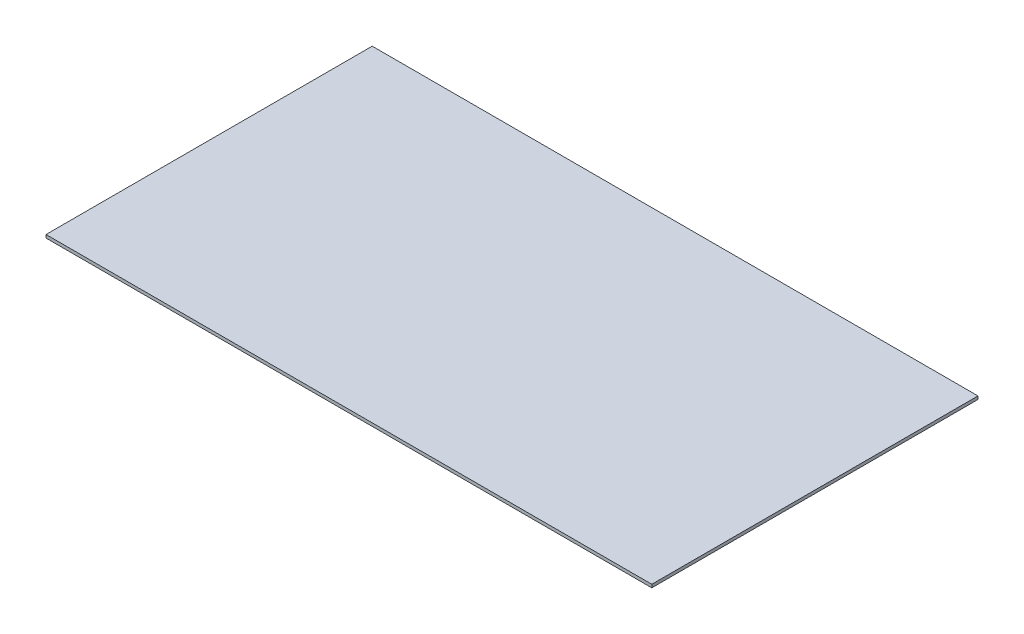
ISO-10303-21;
HEADER;
FILE_DESCRIPTION(('STEP AP214'),'2;1');
FILE_NAME('part.step','',(''),(''),'','','');
FILE_SCHEMA(('AUTOMOTIVE_DESIGN { 1 0 10303 214 1 1 1 1 }'));
ENDSEC;
DATA;
#1=APPLICATION_CONTEXT('core data for automotive mechanical design processes');
#2=APPLICATION_PROTOCOL_DEFINITION('international standard','automotive_design',2000,#1);
#3=PRODUCT_CONTEXT('',#1,'mechanical');
#4=PRODUCT('Part','Part','',(#3));
#5=PRODUCT_RELATED_PRODUCT_CATEGORY('part','',(#4));
#6=PRODUCT_DEFINITION_FORMATION('','',#4);
#7=PRODUCT_DEFINITION_CONTEXT('part definition',#1,'design');
#8=PRODUCT_DEFINITION('design','',#6,#7);
#9=PRODUCT_DEFINITION_SHAPE('','',#8);
#10=(LENGTH_UNIT() NAMED_UNIT(*) SI_UNIT(.MILLI.,.METRE.));
#11=(NAMED_UNIT(*) PLANE_ANGLE_UNIT() SI_UNIT($,.RADIAN.));
#12=(NAMED_UNIT(*) SI_UNIT($,.STERADIAN.) SOLID_ANGLE_UNIT());
#13=UNCERTAINTY_MEASURE_WITH_UNIT(LENGTH_MEASURE(1.E-05),#10,'distance_accuracy_value','');
#14=(GEOMETRIC_REPRESENTATION_CONTEXT(3) GLOBAL_UNCERTAINTY_ASSIGNED_CONTEXT((#13)) GLOBAL_UNIT_ASSIGNED_CONTEXT((#10,
#11,#12)) REPRESENTATION_CONTEXT('',''));
#15=CARTESIAN_POINT('',(0.,0.,0.));
#16=DIRECTION('',(0.,0.,1.));
#17=DIRECTION('',(1.,0.,0.));
#18=AXIS2_PLACEMENT_3D('',#15,#16,#17);
#19=CARTESIAN_POINT('',(1950.,-4.99999999999998,-525.));
#20=DIRECTION('',(0.,0.,1.));
#21=DIRECTION('',(1.,0.,0.));
#22=AXIS2_PLACEMENT_3D('',#19,#20,#21);
#23=PLANE('',#22);
#24=DIRECTION('',(0.,1.,0.));
#25=VECTOR('',#24,1.);
#26=CARTESIAN_POINT('',(0.,-4.99999999999998,-525.));
#27=LINE('',#26,#25);
#28=CARTESIAN_POINT('',(0.,-4.99999999999998,-525.));
#29=VERTEX_POINT('',#28);
#30=CARTESIAN_POINT('',(0.,5.00000000000002,-525.));
#31=VERTEX_POINT('',#30);
#32=EDGE_CURVE('E96',#29,#31,#27,.T.);
#33=ORIENTED_EDGE('',*,*,#32,.T.);
#34=DIRECTION('',(-1.,0.,0.));
#35=VECTOR('',#34,1.);
#36=CARTESIAN_POINT('',(1950.,5.00000000000002,-525.));
#37=LINE('',#36,#35);
#38=CARTESIAN_POINT('',(1950.,5.00000000000002,-525.));
#39=VERTEX_POINT('',#38);
#40=EDGE_CURVE('E11',#39,#31,#37,.T.);
#41=ORIENTED_EDGE('',*,*,#40,.F.);
#42=DIRECTION('',(0.,1.,0.));
#43=VECTOR('',#42,1.);
#44=CARTESIAN_POINT('',(1950.,-4.99999999999998,-525.));
#45=LINE('',#44,#43);
#46=CARTESIAN_POINT('',(1950.,-4.99999999999998,-525.));
#47=VERTEX_POINT('',#46);
#48=EDGE_CURVE('E84',#47,#39,#45,.T.);
#49=ORIENTED_EDGE('',*,*,#48,.F.);
#50=DIRECTION('',(-1.,0.,0.));
#51=VECTOR('',#50,1.);
#52=CARTESIAN_POINT('',(1950.,-4.99999999999998,-525.));
#53=LINE('',#52,#51);
#54=EDGE_CURVE('E92',#47,#29,#53,.T.);
#55=ORIENTED_EDGE('',*,*,#54,.T.);
#56=EDGE_LOOP('',(#33,#41,#49,#55));
#57=FACE_BOUND('',#56,.T.);
#58=ADVANCED_FACE('F33',(#57),#23,.F.);
#59=CARTESIAN_POINT('',(1950.,5.00000000000002,525.));
#60=DIRECTION('',(0.,-1.,0.));
#61=DIRECTION('',(0.,0.,-1.));
#62=AXIS2_PLACEMENT_3D('',#59,#60,#61);
#63=PLANE('',#62);
#64=DIRECTION('',(0.,0.,1.));
#65=VECTOR('',#64,1.);
#66=CARTESIAN_POINT('',(0.,5.00000000000002,525.));
#67=LINE('',#66,#65);
#68=CARTESIAN_POINT('',(0.,5.00000000000002,525.));
#69=VERTEX_POINT('',#68);
#70=EDGE_CURVE('E88',#31,#69,#67,.T.);
#71=ORIENTED_EDGE('',*,*,#70,.T.);
#72=DIRECTION('',(-1.,0.,0.));
#73=VECTOR('',#72,1.);
#74=CARTESIAN_POINT('',(1950.,5.00000000000002,525.));
#75=LINE('',#74,#73);
#76=CARTESIAN_POINT('',(1950.,5.00000000000002,525.));
#77=VERTEX_POINT('',#76);
#78=EDGE_CURVE('E41',#77,#69,#75,.T.);
#79=ORIENTED_EDGE('',*,*,#78,.F.);
#80=DIRECTION('',(0.,0.,1.));
#81=VECTOR('',#80,1.);
#82=CARTESIAN_POINT('',(1950.,5.00000000000002,525.));
#83=LINE('',#82,#81);
#84=EDGE_CURVE('E79',#39,#77,#83,.T.);
#85=ORIENTED_EDGE('',*,*,#84,.F.);
#86=ORIENTED_EDGE('',*,*,#40,.T.);
#87=EDGE_LOOP('',(#71,#79,#85,#86));
#88=FACE_BOUND('',#87,.T.);
#89=ADVANCED_FACE('F87',(#88),#63,.F.);
#90=CARTESIAN_POINT('',(1950.,-4.99999999999998,525.));
#91=DIRECTION('',(0.,0.,-1.));
#92=DIRECTION('',(-1.,0.,0.));
#93=AXIS2_PLACEMENT_3D('',#90,#91,#92);
#94=PLANE('',#93);
#95=DIRECTION('',(0.,-1.,0.));
#96=VECTOR('',#95,1.);
#97=CARTESIAN_POINT('',(0.,-4.99999999999998,525.));
#98=LINE('',#97,#96);
#99=CARTESIAN_POINT('',(0.,-4.99999999999998,525.));
#100=VERTEX_POINT('',#99);
#101=EDGE_CURVE('E66',#69,#100,#98,.T.);
#102=ORIENTED_EDGE('',*,*,#101,.T.);
#103=DIRECTION('',(-1.,0.,0.));
#104=VECTOR('',#103,1.);
#105=CARTESIAN_POINT('',(1950.,-4.99999999999998,525.));
#106=LINE('',#105,#104);
#107=CARTESIAN_POINT('',(1950.,-4.99999999999998,525.));
#108=VERTEX_POINT('',#107);
#109=EDGE_CURVE('E89',#108,#100,#106,.T.);
#110=ORIENTED_EDGE('',*,*,#109,.F.);
#111=DIRECTION('',(0.,-1.,0.));
#112=VECTOR('',#111,1.);
#113=CARTESIAN_POINT('',(1950.,-4.99999999999998,525.));
#114=LINE('',#113,#112);
#115=EDGE_CURVE('E82',#77,#108,#114,.T.);
#116=ORIENTED_EDGE('',*,*,#115,.F.);
#117=ORIENTED_EDGE('',*,*,#78,.T.);
#118=EDGE_LOOP('',(#102,#110,#116,#117));
#119=FACE_BOUND('',#118,.T.);
#120=ADVANCED_FACE('F90',(#119),#94,.F.);
#121=CARTESIAN_POINT('',(1950.,-4.99999999999998,525.));
#122=DIRECTION('',(0.,1.,0.));
#123=DIRECTION('',(0.,0.,1.));
#124=AXIS2_PLACEMENT_3D('',#121,#122,#123);
#125=PLANE('',#124);
#126=DIRECTION('',(0.,0.,-1.));
#127=VECTOR('',#126,1.);
#128=CARTESIAN_POINT('',(0.,-4.99999999999998,525.));
#129=LINE('',#128,#127);
#130=EDGE_CURVE('E72',#100,#29,#129,.T.);
#131=ORIENTED_EDGE('',*,*,#130,.T.);
#132=ORIENTED_EDGE('',*,*,#54,.F.);
#133=DIRECTION('',(0.,0.,-1.));
#134=VECTOR('',#133,1.);
#135=CARTESIAN_POINT('',(1950.,-4.99999999999998,525.));
#136=LINE('',#135,#134);
#137=EDGE_CURVE('E49',#108,#47,#136,.T.);
#138=ORIENTED_EDGE('',*,*,#137,.F.);
#139=ORIENTED_EDGE('',*,*,#109,.T.);
#140=EDGE_LOOP('',(#131,#132,#138,#139));
#141=FACE_BOUND('',#140,.T.);
#142=ADVANCED_FACE('F103',(#141),#125,.F.);
#143=CARTESIAN_POINT('',(1950.,0.,0.));
#144=DIRECTION('',(-1.,0.,0.));
#145=DIRECTION('',(0.,0.,1.));
#146=AXIS2_PLACEMENT_3D('',#143,#144,#145);
#147=PLANE('',#146);
#148=ORIENTED_EDGE('',*,*,#48,.T.);
#149=ORIENTED_EDGE('',*,*,#84,.T.);
#150=ORIENTED_EDGE('',*,*,#115,.T.);
#151=ORIENTED_EDGE('',*,*,#137,.T.);
#152=EDGE_LOOP('',(#148,#149,#150,#151));
#153=FACE_BOUND('',#152,.T.);
#154=ADVANCED_FACE('F80',(#153),#147,.F.);
#155=CARTESIAN_POINT('',(0.,0.,0.));
#156=DIRECTION('',(-1.,0.,0.));
#157=DIRECTION('',(0.,0.,1.));
#158=AXIS2_PLACEMENT_3D('',#155,#156,#157);
#159=PLANE('',#158);
#160=ORIENTED_EDGE('',*,*,#32,.F.);
#161=ORIENTED_EDGE('',*,*,#130,.F.);
#162=ORIENTED_EDGE('',*,*,#101,.F.);
#163=ORIENTED_EDGE('',*,*,#70,.F.);
#164=EDGE_LOOP('',(#160,#161,#162,#163));
#165=FACE_BOUND('',#164,.T.);
#166=ADVANCED_FACE('F106',(#165),#159,.T.);
#167=CLOSED_SHELL('',(#58,#89,#120,#142,#154,#166));
#168=MANIFOLD_SOLID_BREP('B2',#167);
#169=ADVANCED_BREP_SHAPE_REPRESENTATION('',(#18,#168),#14);
#170=SHAPE_DEFINITION_REPRESENTATION(#9,#169);
ENDSEC;
END-ISO-10303-21;
